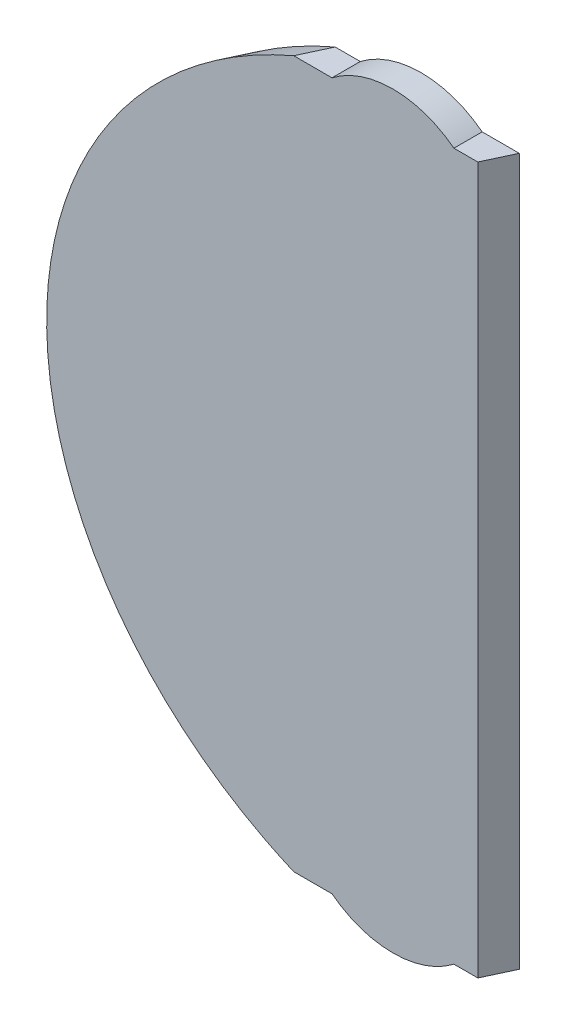
ISO-10303-21;
HEADER;
FILE_DESCRIPTION(('STEP AP214'),'2;1');
FILE_NAME('part.step','',(''),(''),'','','');
FILE_SCHEMA(('AUTOMOTIVE_DESIGN { 1 0 10303 214 1 1 1 1 }'));
ENDSEC;
DATA;
#1=APPLICATION_CONTEXT('core data for automotive mechanical design processes');
#2=APPLICATION_PROTOCOL_DEFINITION('international standard','automotive_design',2000,#1);
#3=PRODUCT_CONTEXT('',#1,'mechanical');
#4=PRODUCT('Part','Part','',(#3));
#5=PRODUCT_RELATED_PRODUCT_CATEGORY('part','',(#4));
#6=PRODUCT_DEFINITION_FORMATION('','',#4);
#7=PRODUCT_DEFINITION_CONTEXT('part definition',#1,'design');
#8=PRODUCT_DEFINITION('design','',#6,#7);
#9=PRODUCT_DEFINITION_SHAPE('','',#8);
#10=(LENGTH_UNIT() NAMED_UNIT(*) SI_UNIT(.MILLI.,.METRE.));
#11=(NAMED_UNIT(*) PLANE_ANGLE_UNIT() SI_UNIT($,.RADIAN.));
#12=(NAMED_UNIT(*) SI_UNIT($,.STERADIAN.) SOLID_ANGLE_UNIT());
#13=UNCERTAINTY_MEASURE_WITH_UNIT(LENGTH_MEASURE(1.E-05),#10,'distance_accuracy_value','');
#14=(GEOMETRIC_REPRESENTATION_CONTEXT(3) GLOBAL_UNCERTAINTY_ASSIGNED_CONTEXT((#13)) GLOBAL_UNIT_ASSIGNED_CONTEXT((#10,
#11,#12)) REPRESENTATION_CONTEXT('',''));
#15=CARTESIAN_POINT('',(0.,0.,0.));
#16=DIRECTION('',(0.,0.,1.));
#17=DIRECTION('',(1.,0.,0.));
#18=AXIS2_PLACEMENT_3D('',#15,#16,#17);
#19=CARTESIAN_POINT('',(-5.82569740421934,10.795,0.431810345133612));
#20=DIRECTION('',(0.,-1.,0.));
#21=DIRECTION('',(1.,0.,0.));
#22=AXIS2_PLACEMENT_3D('',#19,#20,#21);
#23=PLANE('',#22);
#24=DIRECTION('',(-1.,0.,0.));
#25=VECTOR('',#24,1.);
#26=CARTESIAN_POINT('',(-5.42298446260663,10.795,-0.431810345133612));
#27=LINE('',#26,#25);
#28=CARTESIAN_POINT('',(0.201356470806358,10.795,-0.431810345133612));
#29=VERTEX_POINT('',#28);
#30=CARTESIAN_POINT('',(-0.93181445607587,10.795,-0.431810345133613));
#31=VERTEX_POINT('',#30);
#32=EDGE_CURVE('E124',#29,#31,#27,.T.);
#33=ORIENTED_EDGE('',*,*,#32,.T.);
#34=DIRECTION('',(0.,0.,-1.));
#35=VECTOR('',#34,1.);
#36=CARTESIAN_POINT('',(-0.93181445607587,10.795,4.20992693941706));
#37=LINE('',#36,#35);
#38=CARTESIAN_POINT('',(-0.931814456075871,10.795,0.431810345133613));
#39=VERTEX_POINT('',#38);
#40=EDGE_CURVE('E108',#39,#31,#37,.T.);
#41=ORIENTED_EDGE('',*,*,#40,.F.);
#42=DIRECTION('',(-1.,0.,0.));
#43=VECTOR('',#42,1.);
#44=CARTESIAN_POINT('',(-5.82569740421934,10.795,0.431810345133612));
#45=LINE('',#44,#43);
#46=CARTESIAN_POINT('',(-0.201356470806352,10.795,0.431810345133612));
#47=VERTEX_POINT('',#46);
#48=EDGE_CURVE('E141',#47,#39,#45,.T.);
#49=ORIENTED_EDGE('',*,*,#48,.F.);
#50=DIRECTION('',(0.422618261740697,0.,-0.906307787036651));
#51=VECTOR('',#50,1.);
#52=CARTESIAN_POINT('',(-0.201356470806352,10.795,0.431810345133612));
#53=LINE('',#52,#51);
#54=EDGE_CURVE('E129',#47,#29,#53,.T.);
#55=ORIENTED_EDGE('',*,*,#54,.T.);
#56=EDGE_LOOP('',(#33,#41,#49,#55));
#57=FACE_BOUND('',#56,.T.);
#58=ADVANCED_FACE('F43',(#57),#23,.F.);
#59=CARTESIAN_POINT('',(-0.201356470806352,-10.795,0.431810345133612));
#60=DIRECTION('',(0.,1.,0.));
#61=DIRECTION('',(0.,0.,1.));
#62=AXIS2_PLACEMENT_3D('',#59,#60,#61);
#63=PLANE('',#62);
#64=DIRECTION('',(1.,0.,0.));
#65=VECTOR('',#64,1.);
#66=CARTESIAN_POINT('',(0.201356470806358,-10.795,-0.431810345133612));
#67=LINE('',#66,#65);
#68=CARTESIAN_POINT('',(-5.42298446260663,-10.795,-0.431810345133612));
#69=VERTEX_POINT('',#68);
#70=CARTESIAN_POINT('',(-4.65618554392413,-10.795,-0.431810345133613));
#71=VERTEX_POINT('',#70);
#72=EDGE_CURVE('E153',#69,#71,#67,.T.);
#73=ORIENTED_EDGE('',*,*,#72,.T.);
#74=DIRECTION('',(0.,0.,-1.));
#75=VECTOR('',#74,1.);
#76=CARTESIAN_POINT('',(-4.65618554392413,-10.795,4.20992693941706));
#77=LINE('',#76,#75);
#78=CARTESIAN_POINT('',(-4.65618554392413,-10.795,0.431810345133613));
#79=VERTEX_POINT('',#78);
#80=EDGE_CURVE('E167',#79,#71,#77,.T.);
#81=ORIENTED_EDGE('',*,*,#80,.F.);
#82=DIRECTION('',(1.,0.,0.));
#83=VECTOR('',#82,1.);
#84=CARTESIAN_POINT('',(-0.201356470806352,-10.795,0.431810345133612));
#85=LINE('',#84,#83);
#86=CARTESIAN_POINT('',(-5.82569740421934,-10.795,0.431810345133612));
#87=VERTEX_POINT('',#86);
#88=EDGE_CURVE('E164',#87,#79,#85,.T.);
#89=ORIENTED_EDGE('',*,*,#88,.F.);
#90=DIRECTION('',(0.422618261740697,0.,-0.906307787036651));
#91=VECTOR('',#90,1.);
#92=CARTESIAN_POINT('',(-5.82569740421934,-10.795,0.431810345133612));
#93=LINE('',#92,#91);
#94=EDGE_CURVE('E11',#87,#69,#93,.T.);
#95=ORIENTED_EDGE('',*,*,#94,.T.);
#96=EDGE_LOOP('',(#73,#81,#89,#95));
#97=FACE_BOUND('',#96,.T.);
#98=ADVANCED_FACE('F177',(#97),#63,.F.);
#99=DIRECTION('',(0.,0.,-1.));
#100=VECTOR('',#99,1.);
#101=CARTESIAN_POINT('',(-4.65618554392413,10.795,4.20992693941706));
#102=LINE('',#101,#100);
#103=CARTESIAN_POINT('',(-4.65618554392413,10.795,0.431810345133612));
#104=VERTEX_POINT('',#103);
#105=CARTESIAN_POINT('',(-4.65618554392413,10.795,-0.431810345133613));
#106=VERTEX_POINT('',#105);
#107=EDGE_CURVE('E116',#104,#106,#102,.T.);
#108=ORIENTED_EDGE('',*,*,#107,.T.);
#109=CARTESIAN_POINT('',(-5.42298446260663,10.795,-0.431810345133612));
#110=VERTEX_POINT('',#109);
#111=EDGE_CURVE('E125',#106,#110,#27,.T.);
#112=ORIENTED_EDGE('',*,*,#111,.T.);
#113=DIRECTION('',(0.422618261740697,0.,-0.906307787036651));
#114=VECTOR('',#113,1.);
#115=CARTESIAN_POINT('',(-5.82569740421934,10.795,0.431810345133612));
#116=LINE('',#115,#114);
#117=CARTESIAN_POINT('',(-5.82569740421934,10.795,0.431810345133612));
#118=VERTEX_POINT('',#117);
#119=EDGE_CURVE('E138',#118,#110,#116,.T.);
#120=ORIENTED_EDGE('',*,*,#119,.F.);
#121=EDGE_CURVE('E162',#104,#118,#45,.T.);
#122=ORIENTED_EDGE('',*,*,#121,.F.);
#123=EDGE_LOOP('',(#108,#112,#120,#122));
#124=FACE_BOUND('',#123,.T.);
#125=ADVANCED_FACE('F185',(#124),#23,.F.);
#126=DIRECTION('',(0.,0.,-1.));
#127=VECTOR('',#126,1.);
#128=CARTESIAN_POINT('',(-0.93181445607587,-10.795,4.20992693941706));
#129=LINE('',#128,#127);
#130=CARTESIAN_POINT('',(-0.93181445607587,-10.795,0.431810345133612));
#131=VERTEX_POINT('',#130);
#132=CARTESIAN_POINT('',(-0.931814456075871,-10.795,-0.431810345133613));
#133=VERTEX_POINT('',#132);
#134=EDGE_CURVE('E169',#131,#133,#129,.T.);
#135=ORIENTED_EDGE('',*,*,#134,.T.);
#136=CARTESIAN_POINT('',(0.201356470806358,-10.795,-0.431810345133612));
#137=VERTEX_POINT('',#136);
#138=EDGE_CURVE('E152',#133,#137,#67,.T.);
#139=ORIENTED_EDGE('',*,*,#138,.T.);
#140=DIRECTION('',(0.422618261740697,0.,-0.906307787036651));
#141=VECTOR('',#140,1.);
#142=CARTESIAN_POINT('',(-0.201356470806352,-10.795,0.431810345133612));
#143=LINE('',#142,#141);
#144=CARTESIAN_POINT('',(-0.201356470806352,-10.795,0.431810345133612));
#145=VERTEX_POINT('',#144);
#146=EDGE_CURVE('E52',#145,#137,#143,.T.);
#147=ORIENTED_EDGE('',*,*,#146,.F.);
#148=EDGE_CURVE('E133',#131,#145,#85,.T.);
#149=ORIENTED_EDGE('',*,*,#148,.F.);
#150=EDGE_LOOP('',(#135,#139,#147,#149));
#151=FACE_BOUND('',#150,.T.);
#152=ADVANCED_FACE('F187',(#151),#63,.F.);
#153=CARTESIAN_POINT('',(-0.201356470806355,0.,0.431810345133612));
#154=DIRECTION('',(0.,0.,1.));
#155=DIRECTION('',(-1.,0.,0.));
#156=AXIS2_PLACEMENT_3D('',#153,#154,#155);
#157=ELLIPSE('',#156,13.172,11.938);
#158=DIRECTION('',(0.422618261740697,0.,-0.906307787036651));
#159=VECTOR('',#158,1.);
#160=SURFACE_OF_LINEAR_EXTRUSION('',#157,#159);
#161=CARTESIAN_POINT('',(0.201356470806355,0.,-0.431810345133612));
#162=DIRECTION('',(0.,0.,1.));
#163=DIRECTION('',(-1.,0.,0.));
#164=AXIS2_PLACEMENT_3D('',#161,#162,#163);
#165=ELLIPSE('',#164,13.172,11.938);
#166=EDGE_CURVE('E157',#110,#69,#165,.T.);
#167=ORIENTED_EDGE('',*,*,#166,.T.);
#168=ORIENTED_EDGE('',*,*,#94,.F.);
#169=EDGE_CURVE('E130',#118,#87,#157,.T.);
#170=ORIENTED_EDGE('',*,*,#169,.F.);
#171=ORIENTED_EDGE('',*,*,#119,.T.);
#172=EDGE_LOOP('',(#167,#168,#170,#171));
#173=FACE_BOUND('',#172,.T.);
#174=ADVANCED_FACE('F45',(#173),#160,.F.);
#175=CARTESIAN_POINT('',(-0.201356470806352,-10.795,0.431810345133612));
#176=DIRECTION('',(-0.906307787036651,0.,-0.422618261740697));
#177=DIRECTION('',(-0.422618261740697,0.,0.906307787036651));
#178=AXIS2_PLACEMENT_3D('',#175,#176,#177);
#179=PLANE('',#178);
#180=DIRECTION('',(0.,1.,0.));
#181=VECTOR('',#180,1.);
#182=CARTESIAN_POINT('',(0.201356470806358,-10.795,-0.431810345133612));
#183=LINE('',#182,#181);
#184=EDGE_CURVE('E134',#137,#29,#183,.T.);
#185=ORIENTED_EDGE('',*,*,#184,.T.);
#186=ORIENTED_EDGE('',*,*,#54,.F.);
#187=DIRECTION('',(0.,1.,0.));
#188=VECTOR('',#187,1.);
#189=CARTESIAN_POINT('',(-0.201356470806352,-10.795,0.431810345133612));
#190=LINE('',#189,#188);
#191=EDGE_CURVE('E147',#145,#47,#190,.T.);
#192=ORIENTED_EDGE('',*,*,#191,.F.);
#193=ORIENTED_EDGE('',*,*,#146,.T.);
#194=EDGE_LOOP('',(#185,#186,#192,#193));
#195=FACE_BOUND('',#194,.T.);
#196=ADVANCED_FACE('F146',(#195),#179,.F.);
#197=CARTESIAN_POINT('',(-0.201356470806355,0.,0.431810345133612));
#198=DIRECTION('',(0.,0.,1.));
#199=DIRECTION('',(1.,0.,0.));
#200=AXIS2_PLACEMENT_3D('',#197,#198,#199);
#201=PLANE('',#200);
#202=ORIENTED_EDGE('',*,*,#169,.T.);
#203=ORIENTED_EDGE('',*,*,#88,.T.);
#204=CARTESIAN_POINT('',(-2.794,-8.382,0.431810345133613));
#205=DIRECTION('',(0.,0.,1.));
#206=DIRECTION('',(1.,0.,0.));
#207=AXIS2_PLACEMENT_3D('',#204,#205,#206);
#208=CIRCLE('',#207,3.048);
#209=EDGE_CURVE('E66',#79,#131,#208,.T.);
#210=ORIENTED_EDGE('',*,*,#209,.T.);
#211=ORIENTED_EDGE('',*,*,#148,.T.);
#212=ORIENTED_EDGE('',*,*,#191,.T.);
#213=ORIENTED_EDGE('',*,*,#48,.T.);
#214=CARTESIAN_POINT('',(-2.794,8.38200000000002,0.431810345133613));
#215=DIRECTION('',(0.,0.,1.));
#216=DIRECTION('',(1.,0.,0.));
#217=AXIS2_PLACEMENT_3D('',#214,#215,#216);
#218=CIRCLE('',#217,3.048);
#219=EDGE_CURVE('E59',#39,#104,#218,.T.);
#220=ORIENTED_EDGE('',*,*,#219,.T.);
#221=ORIENTED_EDGE('',*,*,#121,.T.);
#222=EDGE_LOOP('',(#202,#203,#210,#211,#212,#213,#220,#221));
#223=FACE_BOUND('',#222,.T.);
#224=ADVANCED_FACE('F178',(#223),#201,.T.);
#225=CARTESIAN_POINT('',(0.201356470806355,0.,-0.431810345133612));
#226=DIRECTION('',(0.,0.,1.));
#227=DIRECTION('',(1.,0.,0.));
#228=AXIS2_PLACEMENT_3D('',#225,#226,#227);
#229=PLANE('',#228);
#230=ORIENTED_EDGE('',*,*,#166,.F.);
#231=ORIENTED_EDGE('',*,*,#111,.F.);
#232=CARTESIAN_POINT('',(-2.794,8.38200000000002,-0.431810345133613));
#233=DIRECTION('',(0.,0.,1.));
#234=DIRECTION('',(1.,0.,0.));
#235=AXIS2_PLACEMENT_3D('',#232,#233,#234);
#236=CIRCLE('',#235,3.048);
#237=EDGE_CURVE('E111',#106,#31,#236,.F.);
#238=ORIENTED_EDGE('',*,*,#237,.T.);
#239=ORIENTED_EDGE('',*,*,#32,.F.);
#240=ORIENTED_EDGE('',*,*,#184,.F.);
#241=ORIENTED_EDGE('',*,*,#138,.F.);
#242=CARTESIAN_POINT('',(-2.794,-8.382,-0.431810345133613));
#243=DIRECTION('',(0.,0.,1.));
#244=DIRECTION('',(1.,0.,0.));
#245=AXIS2_PLACEMENT_3D('',#242,#243,#244);
#246=CIRCLE('',#245,3.048);
#247=EDGE_CURVE('E117',#133,#71,#246,.F.);
#248=ORIENTED_EDGE('',*,*,#247,.T.);
#249=ORIENTED_EDGE('',*,*,#72,.F.);
#250=EDGE_LOOP('',(#230,#231,#238,#239,#240,#241,#248,#249));
#251=FACE_BOUND('',#250,.T.);
#252=ADVANCED_FACE('F122',(#251),#229,.F.);
#253=CARTESIAN_POINT('',(-2.794,-8.382,4.20992693941706));
#254=DIRECTION('',(0.,0.,-1.));
#255=DIRECTION('',(-1.,0.,0.));
#256=AXIS2_PLACEMENT_3D('',#253,#254,#255);
#257=CYLINDRICAL_SURFACE('',#256,3.048);
#258=ORIENTED_EDGE('',*,*,#209,.F.);
#259=ORIENTED_EDGE('',*,*,#80,.T.);
#260=ORIENTED_EDGE('',*,*,#247,.F.);
#261=ORIENTED_EDGE('',*,*,#134,.F.);
#262=EDGE_LOOP('',(#258,#259,#260,#261));
#263=FACE_BOUND('',#262,.T.);
#264=ADVANCED_FACE('F176',(#263),#257,.T.);
#265=CARTESIAN_POINT('',(-2.794,8.38200000000002,4.20992693941706));
#266=DIRECTION('',(0.,0.,-1.));
#267=DIRECTION('',(-1.,0.,0.));
#268=AXIS2_PLACEMENT_3D('',#265,#266,#267);
#269=CYLINDRICAL_SURFACE('',#268,3.048);
#270=ORIENTED_EDGE('',*,*,#219,.F.);
#271=ORIENTED_EDGE('',*,*,#40,.T.);
#272=ORIENTED_EDGE('',*,*,#237,.F.);
#273=ORIENTED_EDGE('',*,*,#107,.F.);
#274=EDGE_LOOP('',(#270,#271,#272,#273));
#275=FACE_BOUND('',#274,.T.);
#276=ADVANCED_FACE('F110',(#275),#269,.T.);
#277=CLOSED_SHELL('',(#58,#98,#125,#152,#174,#196,#224,#252,#264,#276));
#278=MANIFOLD_SOLID_BREP('B2',#277);
#279=ADVANCED_BREP_SHAPE_REPRESENTATION('',(#18,#278),#14);
#280=SHAPE_DEFINITION_REPRESENTATION(#9,#279);
ENDSEC;
END-ISO-10303-21;
